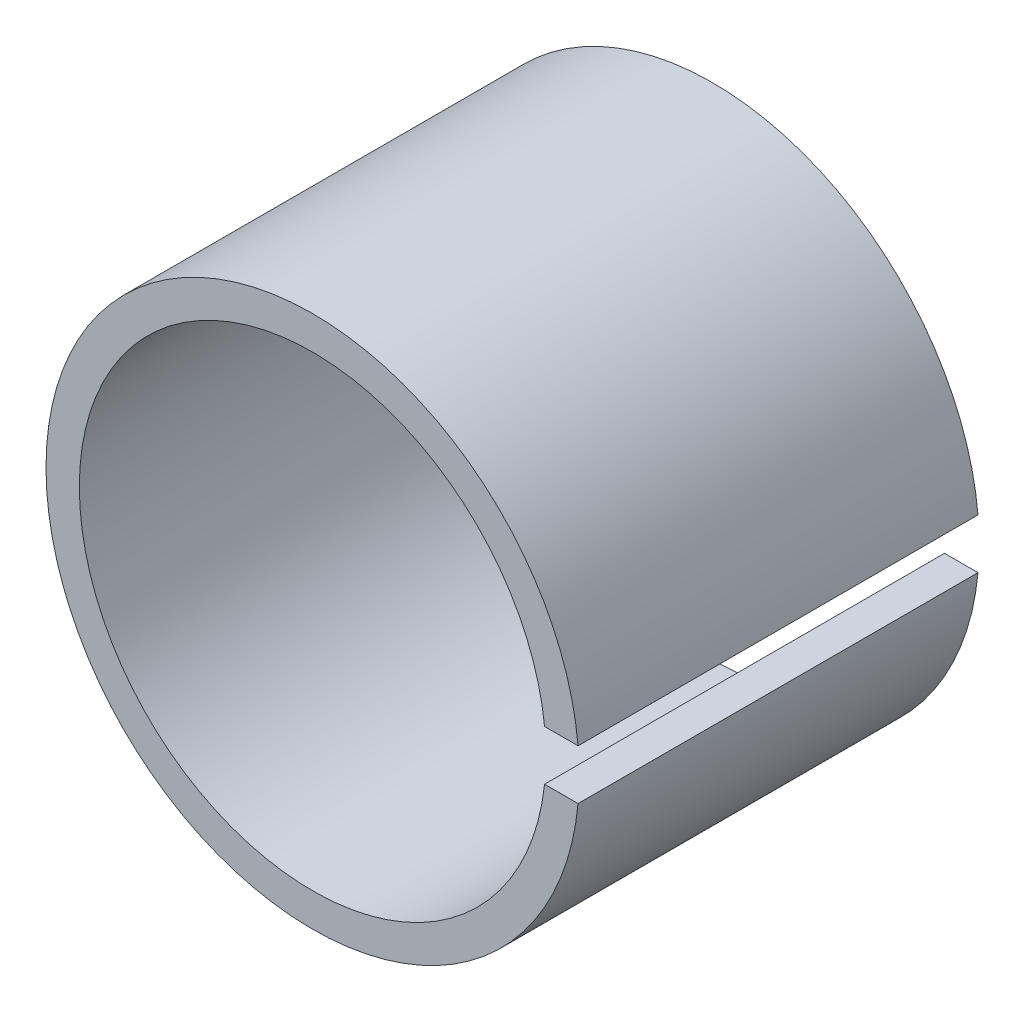
ISO-10303-21;
HEADER;
FILE_DESCRIPTION(('STEP AP214'),'2;1');
FILE_NAME('part.step','',(''),(''),'','','');
FILE_SCHEMA(('AUTOMOTIVE_DESIGN { 1 0 10303 214 1 1 1 1 }'));
ENDSEC;
DATA;
#1=APPLICATION_CONTEXT('core data for automotive mechanical design processes');
#2=APPLICATION_PROTOCOL_DEFINITION('international standard','automotive_design',2000,#1);
#3=PRODUCT_CONTEXT('',#1,'mechanical');
#4=PRODUCT('Part','Part','',(#3));
#5=PRODUCT_RELATED_PRODUCT_CATEGORY('part','',(#4));
#6=PRODUCT_DEFINITION_FORMATION('','',#4);
#7=PRODUCT_DEFINITION_CONTEXT('part definition',#1,'design');
#8=PRODUCT_DEFINITION('design','',#6,#7);
#9=PRODUCT_DEFINITION_SHAPE('','',#8);
#10=(LENGTH_UNIT() NAMED_UNIT(*) SI_UNIT(.MILLI.,.METRE.));
#11=(NAMED_UNIT(*) PLANE_ANGLE_UNIT() SI_UNIT($,.RADIAN.));
#12=(NAMED_UNIT(*) SI_UNIT($,.STERADIAN.) SOLID_ANGLE_UNIT());
#13=UNCERTAINTY_MEASURE_WITH_UNIT(LENGTH_MEASURE(1.E-05),#10,'distance_accuracy_value','');
#14=(GEOMETRIC_REPRESENTATION_CONTEXT(3) GLOBAL_UNCERTAINTY_ASSIGNED_CONTEXT((#13)) GLOBAL_UNIT_ASSIGNED_CONTEXT((#10,
#11,#12)) REPRESENTATION_CONTEXT('',''));
#15=CARTESIAN_POINT('',(0.,0.,0.));
#16=DIRECTION('',(0.,0.,1.));
#17=DIRECTION('',(1.,0.,0.));
#18=AXIS2_PLACEMENT_3D('',#15,#16,#17);
#19=CARTESIAN_POINT('',(6.9597054535375,0.75,0.));
#20=DIRECTION('',(0.,-1.,0.));
#21=DIRECTION('',(0.,0.,-1.));
#22=AXIS2_PLACEMENT_3D('',#19,#20,#21);
#23=PLANE('',#22);
#24=DIRECTION('',(-1.,0.,0.));
#25=VECTOR('',#24,1.);
#26=CARTESIAN_POINT('',(7.964766161037,0.75,0.));
#27=LINE('',#26,#25);
#28=CARTESIAN_POINT('',(6.9597054535375,0.75,0.));
#29=VERTEX_POINT('',#28);
#30=CARTESIAN_POINT('',(7.964766161037,0.75,0.));
#31=VERTEX_POINT('',#30);
#32=EDGE_CURVE('E55',#29,#31,#27,.F.);
#33=ORIENTED_EDGE('',*,*,#32,.F.);
#34=DIRECTION('',(0.,0.,-1.));
#35=VECTOR('',#34,1.);
#36=CARTESIAN_POINT('',(6.9597054535375,0.75,0.));
#37=LINE('',#36,#35);
#38=CARTESIAN_POINT('',(6.95970545353751,0.75,-12.));
#39=VERTEX_POINT('',#38);
#40=EDGE_CURVE('E67',#39,#29,#37,.F.);
#41=ORIENTED_EDGE('',*,*,#40,.F.);
#42=DIRECTION('',(1.,0.,0.));
#43=VECTOR('',#42,1.);
#44=CARTESIAN_POINT('',(6.95970545353751,0.75,-12.));
#45=LINE('',#44,#43);
#46=CARTESIAN_POINT('',(7.964766161037,0.75,-12.));
#47=VERTEX_POINT('',#46);
#48=EDGE_CURVE('E72',#39,#47,#45,.T.);
#49=ORIENTED_EDGE('',*,*,#48,.T.);
#50=DIRECTION('',(0.,0.,1.));
#51=VECTOR('',#50,1.);
#52=CARTESIAN_POINT('',(7.964766161037,0.75,-12.));
#53=LINE('',#52,#51);
#54=EDGE_CURVE('E69',#47,#31,#53,.T.);
#55=ORIENTED_EDGE('',*,*,#54,.T.);
#56=EDGE_LOOP('',(#33,#41,#49,#55));
#57=FACE_BOUND('',#56,.T.);
#58=ADVANCED_FACE('F17',(#57),#23,.T.);
#59=CARTESIAN_POINT('',(0.,0.,-12.));
#60=DIRECTION('',(0.,0.,1.));
#61=DIRECTION('',(-1.,2.75673152198079E-08,0.));
#62=AXIS2_PLACEMENT_3D('',#59,#60,#61);
#63=CYLINDRICAL_SURFACE('',#62,8.);
#64=DIRECTION('',(0.,0.,1.));
#65=VECTOR('',#64,1.);
#66=CARTESIAN_POINT('',(7.964766161037,-0.750000000000004,-12.));
#67=LINE('',#66,#65);
#68=CARTESIAN_POINT('',(7.964766161037,-0.750000000000008,-12.));
#69=VERTEX_POINT('',#68);
#70=CARTESIAN_POINT('',(7.964766161037,-0.750000000000004,0.));
#71=VERTEX_POINT('',#70);
#72=EDGE_CURVE('E83',#69,#71,#67,.T.);
#73=ORIENTED_EDGE('',*,*,#72,.T.);
#74=CARTESIAN_POINT('',(0.,0.,0.));
#75=DIRECTION('',(0.,0.,-1.));
#76=DIRECTION('',(0.995595770129625,-0.0937500000000005,0.));
#77=AXIS2_PLACEMENT_3D('',#74,#75,#76);
#78=CIRCLE('',#77,8.);
#79=EDGE_CURVE('E88',#31,#71,#78,.F.);
#80=ORIENTED_EDGE('',*,*,#79,.F.);
#81=ORIENTED_EDGE('',*,*,#54,.F.);
#82=CARTESIAN_POINT('',(0.,0.,-12.));
#83=DIRECTION('',(0.,0.,1.));
#84=DIRECTION('',(0.995595770129625,0.09375,0.));
#85=AXIS2_PLACEMENT_3D('',#82,#83,#84);
#86=CIRCLE('',#85,8.);
#87=EDGE_CURVE('E92',#47,#69,#86,.T.);
#88=ORIENTED_EDGE('',*,*,#87,.T.);
#89=EDGE_LOOP('',(#73,#80,#81,#88));
#90=FACE_BOUND('',#89,.T.);
#91=ADVANCED_FACE('F115',(#90),#63,.T.);
#92=CARTESIAN_POINT('',(6.9597054535375,-0.75,-12.));
#93=DIRECTION('',(0.,1.,0.));
#94=DIRECTION('',(0.,0.,1.));
#95=AXIS2_PLACEMENT_3D('',#92,#93,#94);
#96=PLANE('',#95);
#97=DIRECTION('',(1.,0.,0.));
#98=VECTOR('',#97,1.);
#99=CARTESIAN_POINT('',(6.95970545353751,-0.75,0.));
#100=LINE('',#99,#98);
#101=CARTESIAN_POINT('',(6.95970545353751,-0.75,0.));
#102=VERTEX_POINT('',#101);
#103=EDGE_CURVE('E33',#71,#102,#100,.F.);
#104=ORIENTED_EDGE('',*,*,#103,.F.);
#105=ORIENTED_EDGE('',*,*,#72,.F.);
#106=DIRECTION('',(-1.,0.,0.));
#107=VECTOR('',#106,1.);
#108=CARTESIAN_POINT('',(7.964766161037,-0.75,-12.));
#109=LINE('',#108,#107);
#110=CARTESIAN_POINT('',(6.9597054535375,-0.75,-12.));
#111=VERTEX_POINT('',#110);
#112=EDGE_CURVE('E100',#69,#111,#109,.T.);
#113=ORIENTED_EDGE('',*,*,#112,.T.);
#114=DIRECTION('',(0.,0.,1.));
#115=VECTOR('',#114,1.);
#116=CARTESIAN_POINT('',(6.9597054535375,-0.75,-12.));
#117=LINE('',#116,#115);
#118=EDGE_CURVE('E61',#111,#102,#117,.T.);
#119=ORIENTED_EDGE('',*,*,#118,.T.);
#120=EDGE_LOOP('',(#104,#105,#113,#119));
#121=FACE_BOUND('',#120,.T.);
#122=ADVANCED_FACE('F111',(#121),#96,.T.);
#123=CARTESIAN_POINT('',(0.,0.,-12.));
#124=DIRECTION('',(0.,0.,1.));
#125=DIRECTION('',(0.994243636219647,0.107142857142857,0.));
#126=AXIS2_PLACEMENT_3D('',#123,#124,#125);
#127=CYLINDRICAL_SURFACE('',#126,7.);
#128=ORIENTED_EDGE('',*,*,#40,.T.);
#129=CARTESIAN_POINT('',(0.,0.,0.));
#130=DIRECTION('',(0.,0.,1.));
#131=DIRECTION('',(0.994243636219647,0.107142857142857,0.));
#132=AXIS2_PLACEMENT_3D('',#129,#130,#131);
#133=CIRCLE('',#132,7.);
#134=EDGE_CURVE('E26',#29,#102,#133,.T.);
#135=ORIENTED_EDGE('',*,*,#134,.T.);
#136=ORIENTED_EDGE('',*,*,#118,.F.);
#137=CARTESIAN_POINT('',(0.,0.,-12.));
#138=DIRECTION('',(0.,0.,-1.));
#139=DIRECTION('',(0.994243636219647,-0.107142857142857,0.));
#140=AXIS2_PLACEMENT_3D('',#137,#138,#139);
#141=CIRCLE('',#140,7.);
#142=EDGE_CURVE('E11',#39,#111,#141,.F.);
#143=ORIENTED_EDGE('',*,*,#142,.F.);
#144=EDGE_LOOP('',(#128,#135,#136,#143));
#145=FACE_BOUND('',#144,.T.);
#146=ADVANCED_FACE('F71',(#145),#127,.F.);
#147=CARTESIAN_POINT('',(-8.00091022366451,-7.99999981891209,-12.));
#148=DIRECTION('',(0.,0.,-1.));
#149=DIRECTION('',(0.,1.,0.));
#150=AXIS2_PLACEMENT_3D('',#147,#148,#149);
#151=PLANE('',#150);
#152=ORIENTED_EDGE('',*,*,#87,.F.);
#153=ORIENTED_EDGE('',*,*,#48,.F.);
#154=ORIENTED_EDGE('',*,*,#142,.T.);
#155=ORIENTED_EDGE('',*,*,#112,.F.);
#156=EDGE_LOOP('',(#152,#153,#154,#155));
#157=FACE_BOUND('',#156,.T.);
#158=ADVANCED_FACE('F113',(#157),#151,.T.);
#159=CARTESIAN_POINT('',(-8.00109942439773,-8.16985324071277,0.));
#160=DIRECTION('',(0.,0.,1.));
#161=DIRECTION('',(1.,0.,0.));
#162=AXIS2_PLACEMENT_3D('',#159,#160,#161);
#163=PLANE('',#162);
#164=ORIENTED_EDGE('',*,*,#134,.F.);
#165=ORIENTED_EDGE('',*,*,#32,.T.);
#166=ORIENTED_EDGE('',*,*,#79,.T.);
#167=ORIENTED_EDGE('',*,*,#103,.T.);
#168=EDGE_LOOP('',(#164,#165,#166,#167));
#169=FACE_BOUND('',#168,.T.);
#170=ADVANCED_FACE('F19',(#169),#163,.T.);
#171=CLOSED_SHELL('',(#58,#91,#122,#146,#158,#170));
#172=MANIFOLD_SOLID_BREP('B1',#171);
#173=ADVANCED_BREP_SHAPE_REPRESENTATION('',(#18,#172),#14);
#174=SHAPE_DEFINITION_REPRESENTATION(#9,#173);
ENDSEC;
END-ISO-10303-21;
